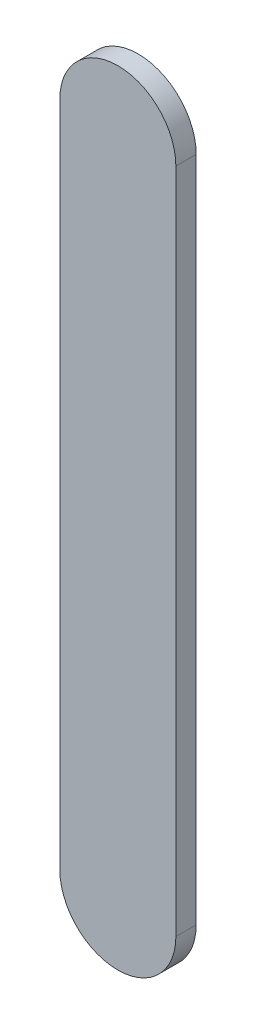
ISO-10303-21;
HEADER;
FILE_DESCRIPTION(('STEP AP214'),'2;1');
FILE_NAME('part.step','',(''),(''),'','','');
FILE_SCHEMA(('AUTOMOTIVE_DESIGN { 1 0 10303 214 1 1 1 1 }'));
ENDSEC;
DATA;
#1=APPLICATION_CONTEXT('core data for automotive mechanical design processes');
#2=APPLICATION_PROTOCOL_DEFINITION('international standard','automotive_design',2000,#1);
#3=PRODUCT_CONTEXT('',#1,'mechanical');
#4=PRODUCT('Part','Part','',(#3));
#5=PRODUCT_RELATED_PRODUCT_CATEGORY('part','',(#4));
#6=PRODUCT_DEFINITION_FORMATION('','',#4);
#7=PRODUCT_DEFINITION_CONTEXT('part definition',#1,'design');
#8=PRODUCT_DEFINITION('design','',#6,#7);
#9=PRODUCT_DEFINITION_SHAPE('','',#8);
#10=(LENGTH_UNIT() NAMED_UNIT(*) SI_UNIT(.MILLI.,.METRE.));
#11=(NAMED_UNIT(*) PLANE_ANGLE_UNIT() SI_UNIT($,.RADIAN.));
#12=(NAMED_UNIT(*) SI_UNIT($,.STERADIAN.) SOLID_ANGLE_UNIT());
#13=UNCERTAINTY_MEASURE_WITH_UNIT(LENGTH_MEASURE(1.E-05),#10,'distance_accuracy_value','');
#14=(GEOMETRIC_REPRESENTATION_CONTEXT(3) GLOBAL_UNCERTAINTY_ASSIGNED_CONTEXT((#13)) GLOBAL_UNIT_ASSIGNED_CONTEXT((#10,
#11,#12)) REPRESENTATION_CONTEXT('',''));
#15=CARTESIAN_POINT('',(0.,0.,0.));
#16=DIRECTION('',(0.,0.,1.));
#17=DIRECTION('',(1.,0.,0.));
#18=AXIS2_PLACEMENT_3D('',#15,#16,#17);
#19=CARTESIAN_POINT('',(85.075,-115.875,1.635));
#20=DIRECTION('',(0.,0.,1.));
#21=DIRECTION('',(1.,0.,0.));
#22=AXIS2_PLACEMENT_3D('',#19,#20,#21);
#23=PLANE('',#22);
#24=DIRECTION('',(0.,-1.,0.));
#25=VECTOR('',#24,1.);
#26=CARTESIAN_POINT('',(85.075,-115.875,1.635));
#27=LINE('',#26,#25);
#28=CARTESIAN_POINT('',(85.075,-115.875,1.635));
#29=VERTEX_POINT('',#28);
#30=CARTESIAN_POINT('',(85.075,-117.025,1.635));
#31=VERTEX_POINT('',#30);
#32=EDGE_CURVE('E78',#29,#31,#27,.T.);
#33=ORIENTED_EDGE('',*,*,#32,.T.);
#34=CARTESIAN_POINT('',(85.175,-117.025,1.635));
#35=DIRECTION('',(0.,0.,1.));
#36=DIRECTION('',(-1.,0.,0.));
#37=AXIS2_PLACEMENT_3D('',#34,#35,#36);
#38=CIRCLE('',#37,0.1);
#39=CARTESIAN_POINT('',(85.275,-117.025,1.635));
#40=VERTEX_POINT('',#39);
#41=EDGE_CURVE('E76',#31,#40,#38,.T.);
#42=ORIENTED_EDGE('',*,*,#41,.T.);
#43=DIRECTION('',(0.,1.,0.));
#44=VECTOR('',#43,1.);
#45=CARTESIAN_POINT('',(85.275,-117.025,1.635));
#46=LINE('',#45,#44);
#47=CARTESIAN_POINT('',(85.275,-115.875,1.635));
#48=VERTEX_POINT('',#47);
#49=EDGE_CURVE('E65',#40,#48,#46,.T.);
#50=ORIENTED_EDGE('',*,*,#49,.T.);
#51=CARTESIAN_POINT('',(85.175,-115.875,1.635));
#52=DIRECTION('',(0.,0.,1.));
#53=DIRECTION('',(1.,0.,0.));
#54=AXIS2_PLACEMENT_3D('',#51,#52,#53);
#55=CIRCLE('',#54,0.1);
#56=EDGE_CURVE('E11',#48,#29,#55,.T.);
#57=ORIENTED_EDGE('',*,*,#56,.T.);
#58=EDGE_LOOP('',(#33,#42,#50,#57));
#59=FACE_BOUND('',#58,.T.);
#60=ADVANCED_FACE('F17',(#59),#23,.T.);
#61=CARTESIAN_POINT('',(85.075,-115.875,1.6));
#62=DIRECTION('',(0.,0.,1.));
#63=DIRECTION('',(1.,0.,0.));
#64=AXIS2_PLACEMENT_3D('',#61,#62,#63);
#65=PLANE('',#64);
#66=CARTESIAN_POINT('',(85.175,-115.875,1.6));
#67=DIRECTION('',(0.,0.,1.));
#68=DIRECTION('',(1.,0.,0.));
#69=AXIS2_PLACEMENT_3D('',#66,#67,#68);
#70=CIRCLE('',#69,0.1);
#71=CARTESIAN_POINT('',(85.275,-115.875,1.6));
#72=VERTEX_POINT('',#71);
#73=CARTESIAN_POINT('',(85.075,-115.875,1.6));
#74=VERTEX_POINT('',#73);
#75=EDGE_CURVE('E21',#72,#74,#70,.T.);
#76=ORIENTED_EDGE('',*,*,#75,.F.);
#77=DIRECTION('',(0.,1.,0.));
#78=VECTOR('',#77,1.);
#79=CARTESIAN_POINT('',(85.275,-117.025,1.6));
#80=LINE('',#79,#78);
#81=CARTESIAN_POINT('',(85.275,-117.025,1.6));
#82=VERTEX_POINT('',#81);
#83=EDGE_CURVE('E83',#82,#72,#80,.T.);
#84=ORIENTED_EDGE('',*,*,#83,.F.);
#85=CARTESIAN_POINT('',(85.175,-117.025,1.6));
#86=DIRECTION('',(0.,0.,1.));
#87=DIRECTION('',(-1.,0.,0.));
#88=AXIS2_PLACEMENT_3D('',#85,#86,#87);
#89=CIRCLE('',#88,0.1);
#90=CARTESIAN_POINT('',(85.075,-117.025,1.6));
#91=VERTEX_POINT('',#90);
#92=EDGE_CURVE('E86',#91,#82,#89,.T.);
#93=ORIENTED_EDGE('',*,*,#92,.F.);
#94=DIRECTION('',(0.,-1.,0.));
#95=VECTOR('',#94,1.);
#96=CARTESIAN_POINT('',(85.075,-115.875,1.6));
#97=LINE('',#96,#95);
#98=EDGE_CURVE('E108',#74,#91,#97,.T.);
#99=ORIENTED_EDGE('',*,*,#98,.F.);
#100=EDGE_LOOP('',(#76,#84,#93,#99));
#101=FACE_BOUND('',#100,.T.);
#102=ADVANCED_FACE('F122',(#101),#65,.F.);
#103=CARTESIAN_POINT('',(85.175,-115.875,1.6));
#104=DIRECTION('',(0.,0.,-1.));
#105=DIRECTION('',(1.,0.,0.));
#106=AXIS2_PLACEMENT_3D('',#103,#104,#105);
#107=CYLINDRICAL_SURFACE('',#106,0.1);
#108=ORIENTED_EDGE('',*,*,#75,.T.);
#109=DIRECTION('',(0.,0.,1.));
#110=VECTOR('',#109,1.);
#111=CARTESIAN_POINT('',(85.075,-115.875,1.6));
#112=LINE('',#111,#110);
#113=EDGE_CURVE('E93',#74,#29,#112,.T.);
#114=ORIENTED_EDGE('',*,*,#113,.T.);
#115=ORIENTED_EDGE('',*,*,#56,.F.);
#116=DIRECTION('',(0.,0.,1.));
#117=VECTOR('',#116,1.);
#118=CARTESIAN_POINT('',(85.275,-115.875,1.6));
#119=LINE('',#118,#117);
#120=EDGE_CURVE('E72',#72,#48,#119,.T.);
#121=ORIENTED_EDGE('',*,*,#120,.F.);
#122=EDGE_LOOP('',(#108,#114,#115,#121));
#123=FACE_BOUND('',#122,.T.);
#124=ADVANCED_FACE('F19',(#123),#107,.T.);
#125=CARTESIAN_POINT('',(85.275,-117.025,1.6));
#126=DIRECTION('',(-1.,0.,0.));
#127=DIRECTION('',(0.,0.,1.));
#128=AXIS2_PLACEMENT_3D('',#125,#126,#127);
#129=PLANE('',#128);
#130=ORIENTED_EDGE('',*,*,#83,.T.);
#131=ORIENTED_EDGE('',*,*,#120,.T.);
#132=ORIENTED_EDGE('',*,*,#49,.F.);
#133=DIRECTION('',(0.,0.,1.));
#134=VECTOR('',#133,1.);
#135=CARTESIAN_POINT('',(85.275,-117.025,1.6));
#136=LINE('',#135,#134);
#137=EDGE_CURVE('E70',#82,#40,#136,.T.);
#138=ORIENTED_EDGE('',*,*,#137,.F.);
#139=EDGE_LOOP('',(#130,#131,#132,#138));
#140=FACE_BOUND('',#139,.T.);
#141=ADVANCED_FACE('F68',(#140),#129,.F.);
#142=CARTESIAN_POINT('',(85.175,-117.025,1.6));
#143=DIRECTION('',(0.,0.,-1.));
#144=DIRECTION('',(-1.,0.,0.));
#145=AXIS2_PLACEMENT_3D('',#142,#143,#144);
#146=CYLINDRICAL_SURFACE('',#145,0.1);
#147=ORIENTED_EDGE('',*,*,#92,.T.);
#148=ORIENTED_EDGE('',*,*,#137,.T.);
#149=ORIENTED_EDGE('',*,*,#41,.F.);
#150=DIRECTION('',(0.,0.,1.));
#151=VECTOR('',#150,1.);
#152=CARTESIAN_POINT('',(85.075,-117.025,1.6));
#153=LINE('',#152,#151);
#154=EDGE_CURVE('E105',#91,#31,#153,.T.);
#155=ORIENTED_EDGE('',*,*,#154,.F.);
#156=EDGE_LOOP('',(#147,#148,#149,#155));
#157=FACE_BOUND('',#156,.T.);
#158=ADVANCED_FACE('F85',(#157),#146,.T.);
#159=CARTESIAN_POINT('',(85.075,-115.875,1.6));
#160=DIRECTION('',(1.,0.,0.));
#161=DIRECTION('',(0.,1.,0.));
#162=AXIS2_PLACEMENT_3D('',#159,#160,#161);
#163=PLANE('',#162);
#164=ORIENTED_EDGE('',*,*,#98,.T.);
#165=ORIENTED_EDGE('',*,*,#154,.T.);
#166=ORIENTED_EDGE('',*,*,#32,.F.);
#167=ORIENTED_EDGE('',*,*,#113,.F.);
#168=EDGE_LOOP('',(#164,#165,#166,#167));
#169=FACE_BOUND('',#168,.T.);
#170=ADVANCED_FACE('F120',(#169),#163,.F.);
#171=CLOSED_SHELL('',(#60,#102,#124,#141,#158,#170));
#172=MANIFOLD_SOLID_BREP('B1',#171);
#173=ADVANCED_BREP_SHAPE_REPRESENTATION('',(#18,#172),#14);
#174=SHAPE_DEFINITION_REPRESENTATION(#9,#173);
ENDSEC;
END-ISO-10303-21;
